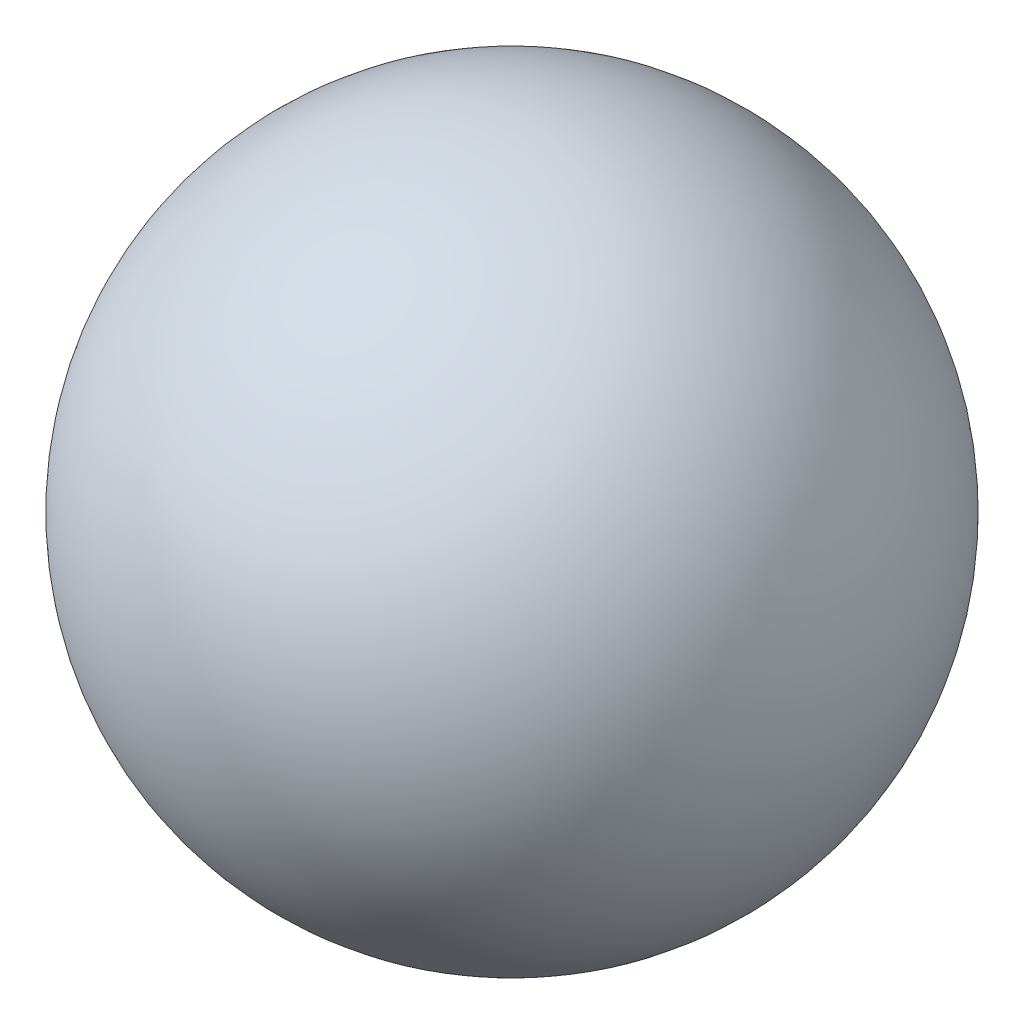
ISO-10303-21;
HEADER;
FILE_DESCRIPTION(('STEP AP214'),'2;1');
FILE_NAME('part.step','',(''),(''),'','','');
FILE_SCHEMA(('AUTOMOTIVE_DESIGN { 1 0 10303 214 1 1 1 1 }'));
ENDSEC;
DATA;
#1=APPLICATION_CONTEXT('core data for automotive mechanical design processes');
#2=APPLICATION_PROTOCOL_DEFINITION('international standard','automotive_design',2000,#1);
#3=PRODUCT_CONTEXT('',#1,'mechanical');
#4=PRODUCT('Part','Part','',(#3));
#5=PRODUCT_RELATED_PRODUCT_CATEGORY('part','',(#4));
#6=PRODUCT_DEFINITION_FORMATION('','',#4);
#7=PRODUCT_DEFINITION_CONTEXT('part definition',#1,'design');
#8=PRODUCT_DEFINITION('design','',#6,#7);
#9=PRODUCT_DEFINITION_SHAPE('','',#8);
#10=(LENGTH_UNIT() NAMED_UNIT(*) SI_UNIT(.MILLI.,.METRE.));
#11=(NAMED_UNIT(*) PLANE_ANGLE_UNIT() SI_UNIT($,.RADIAN.));
#12=(NAMED_UNIT(*) SI_UNIT($,.STERADIAN.) SOLID_ANGLE_UNIT());
#13=UNCERTAINTY_MEASURE_WITH_UNIT(LENGTH_MEASURE(1.E-05),#10,'distance_accuracy_value','');
#14=(GEOMETRIC_REPRESENTATION_CONTEXT(3) GLOBAL_UNCERTAINTY_ASSIGNED_CONTEXT((#13)) GLOBAL_UNIT_ASSIGNED_CONTEXT((#10,
#11,#12)) REPRESENTATION_CONTEXT('',''));
#15=CARTESIAN_POINT('',(0.,0.,0.));
#16=DIRECTION('',(0.,0.,1.));
#17=DIRECTION('',(1.,0.,0.));
#18=AXIS2_PLACEMENT_3D('',#15,#16,#17);
#19=CARTESIAN_POINT('',(0.,0.,0.));
#20=DIRECTION('',(0.,-1.,0.));
#21=DIRECTION('',(-1.,0.,0.));
#22=AXIS2_PLACEMENT_3D('',#19,#20,#21);
#23=SPHERICAL_SURFACE('',#22,4.);
#24=CARTESIAN_POINT('',(0.,-4.,0.));
#25=VERTEX_POINT('',#24);
#26=VERTEX_LOOP('',#25);
#27=FACE_BOUND('',#26,.T.);
#28=ADVANCED_FACE('F30',(#27),#23,.T.);
#29=CLOSED_SHELL('',(#28));
#30=MANIFOLD_SOLID_BREP('B2',#29);
#31=ADVANCED_BREP_SHAPE_REPRESENTATION('',(#18,#30),#14);
#32=SHAPE_DEFINITION_REPRESENTATION(#9,#31);
ENDSEC;
END-ISO-10303-21;
